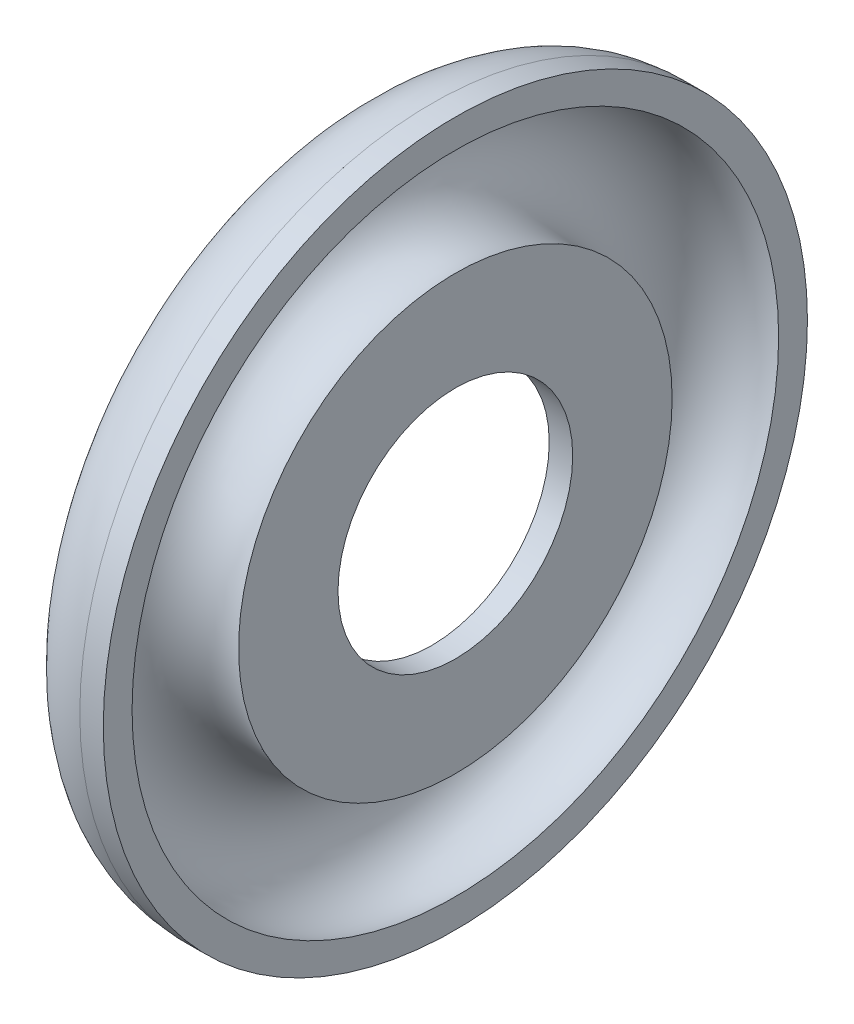
ISO-10303-21;
HEADER;
FILE_DESCRIPTION(('STEP AP214'),'2;1');
FILE_NAME('part.step','',(''),(''),'','','');
FILE_SCHEMA(('AUTOMOTIVE_DESIGN { 1 0 10303 214 1 1 1 1 }'));
ENDSEC;
DATA;
#1=APPLICATION_CONTEXT('core data for automotive mechanical design processes');
#2=APPLICATION_PROTOCOL_DEFINITION('international standard','automotive_design',2000,#1);
#3=PRODUCT_CONTEXT('',#1,'mechanical');
#4=PRODUCT('Part','Part','',(#3));
#5=PRODUCT_RELATED_PRODUCT_CATEGORY('part','',(#4));
#6=PRODUCT_DEFINITION_FORMATION('','',#4);
#7=PRODUCT_DEFINITION_CONTEXT('part definition',#1,'design');
#8=PRODUCT_DEFINITION('design','',#6,#7);
#9=PRODUCT_DEFINITION_SHAPE('','',#8);
#10=(LENGTH_UNIT() NAMED_UNIT(*) SI_UNIT(.MILLI.,.METRE.));
#11=(NAMED_UNIT(*) PLANE_ANGLE_UNIT() SI_UNIT($,.RADIAN.));
#12=(NAMED_UNIT(*) SI_UNIT($,.STERADIAN.) SOLID_ANGLE_UNIT());
#13=UNCERTAINTY_MEASURE_WITH_UNIT(LENGTH_MEASURE(1.E-05),#10,'distance_accuracy_value','');
#14=(GEOMETRIC_REPRESENTATION_CONTEXT(3) GLOBAL_UNCERTAINTY_ASSIGNED_CONTEXT((#13)) GLOBAL_UNIT_ASSIGNED_CONTEXT((#10,
#11,#12)) REPRESENTATION_CONTEXT('',''));
#15=CARTESIAN_POINT('',(0.,0.,0.));
#16=DIRECTION('',(0.,0.,1.));
#17=DIRECTION('',(1.,0.,0.));
#18=AXIS2_PLACEMENT_3D('',#15,#16,#17);
#19=CARTESIAN_POINT('',(0.,0.,0.));
#20=DIRECTION('',(1.,0.,0.));
#21=DIRECTION('',(0.,0.,-1.));
#22=AXIS2_PLACEMENT_3D('',#19,#20,#21);
#23=PLANE('',#22);
#24=CARTESIAN_POINT('',(0.,0.,0.));
#25=DIRECTION('',(1.,0.,0.));
#26=DIRECTION('',(0.,0.,-1.));
#27=AXIS2_PLACEMENT_3D('',#24,#25,#26);
#28=CIRCLE('',#27,15.);
#29=CARTESIAN_POINT('',(0.,0.,-15.));
#30=VERTEX_POINT('',#29);
#31=EDGE_CURVE('E44',#30,#30,#28,.T.);
#32=ORIENTED_EDGE('',*,*,#31,.F.);
#33=EDGE_LOOP('',(#32));
#34=FACE_BOUND('',#33,.T.);
#35=CARTESIAN_POINT('',(0.,0.,0.));
#36=DIRECTION('',(1.,0.,0.));
#37=DIRECTION('',(0.,0.,-1.));
#38=AXIS2_PLACEMENT_3D('',#35,#36,#37);
#39=CIRCLE('',#38,14.9840729394555);
#40=CARTESIAN_POINT('',(0.,0.,-14.9840729394555));
#41=VERTEX_POINT('',#40);
#42=EDGE_CURVE('E70',#41,#41,#39,.T.);
#43=ORIENTED_EDGE('',*,*,#42,.T.);
#44=EDGE_LOOP('',(#43));
#45=FACE_BOUND('',#44,.T.);
#46=ADVANCED_FACE('F40',(#34,#45),#23,.F.);
#47=CARTESIAN_POINT('',(1.,0.,0.));
#48=DIRECTION('',(-1.,0.,0.));
#49=DIRECTION('',(0.,0.,1.));
#50=AXIS2_PLACEMENT_3D('',#47,#48,#49);
#51=CYLINDRICAL_SURFACE('',#50,15.);
#52=CARTESIAN_POINT('',(1.,0.,0.));
#53=DIRECTION('',(1.,0.,0.));
#54=DIRECTION('',(0.,0.,-1.));
#55=AXIS2_PLACEMENT_3D('',#52,#53,#54);
#56=CIRCLE('',#55,15.);
#57=CARTESIAN_POINT('',(1.,0.,-15.));
#58=VERTEX_POINT('',#57);
#59=EDGE_CURVE('E11',#58,#58,#56,.T.);
#60=ORIENTED_EDGE('',*,*,#59,.F.);
#61=EDGE_LOOP('',(#60));
#62=FACE_BOUND('',#61,.T.);
#63=ORIENTED_EDGE('',*,*,#31,.T.);
#64=EDGE_LOOP('',(#63));
#65=FACE_BOUND('',#64,.T.);
#66=ADVANCED_FACE('F42',(#62,#65),#51,.T.);
#67=CARTESIAN_POINT('',(1.,0.,0.));
#68=DIRECTION('',(1.,0.,0.));
#69=DIRECTION('',(0.,0.,-1.));
#70=AXIS2_PLACEMENT_3D('',#67,#68,#69);
#71=PLANE('',#70);
#72=CARTESIAN_POINT('',(1.,0.,0.));
#73=DIRECTION('',(1.,0.,0.));
#74=DIRECTION('',(0.,0.,-1.));
#75=AXIS2_PLACEMENT_3D('',#72,#73,#74);
#76=CIRCLE('',#75,13.7734893729599);
#77=CARTESIAN_POINT('',(1.,0.,-13.7734893729599));
#78=VERTEX_POINT('',#77);
#79=EDGE_CURVE('E75',#78,#78,#76,.T.);
#80=ORIENTED_EDGE('',*,*,#79,.F.);
#81=EDGE_LOOP('',(#80));
#82=FACE_BOUND('',#81,.T.);
#83=ORIENTED_EDGE('',*,*,#59,.T.);
#84=EDGE_LOOP('',(#83));
#85=FACE_BOUND('',#84,.T.);
#86=ADVANCED_FACE('F90',(#82,#85),#71,.T.);
#87=CARTESIAN_POINT('',(0.,0.,0.));
#88=DIRECTION('',(1.,0.,0.));
#89=DIRECTION('',(0.,0.,-1.));
#90=AXIS2_PLACEMENT_3D('',#87,#88,#89);
#91=TOROIDAL_SURFACE('',#90,11.5044268401476,3.47964609930784);
#92=CARTESIAN_POINT('',(0.,0.,-11.5044268401476));
#93=DIRECTION('',(0.,1.,0.));
#94=DIRECTION('',(0.,0.,1.));
#95=AXIS2_PLACEMENT_3D('',#92,#93,#94);
#96=CIRCLE('',#95,3.47964609930784);
#97=CARTESIAN_POINT('',(0.,0.,-8.02478074083979));
#98=VERTEX_POINT('',#97);
#99=EDGE_CURVE('E65',#41,#98,#96,.T.);
#100=ORIENTED_EDGE('',*,*,#99,.F.);
#101=ORIENTED_EDGE('',*,*,#42,.F.);
#102=ORIENTED_EDGE('',*,*,#99,.T.);
#103=CARTESIAN_POINT('',(0.,0.,0.));
#104=DIRECTION('',(1.,0.,0.));
#105=DIRECTION('',(0.,0.,-1.));
#106=AXIS2_PLACEMENT_3D('',#103,#104,#105);
#107=CIRCLE('',#106,8.02478074083979);
#108=EDGE_CURVE('E68',#98,#98,#107,.T.);
#109=ORIENTED_EDGE('',*,*,#108,.T.);
#110=EDGE_LOOP('',(#100,#101,#102,#109));
#111=FACE_BOUND('',#110,.T.);
#112=ADVANCED_FACE('F66',(#111),#91,.T.);
#113=CARTESIAN_POINT('',(0.,0.,0.));
#114=DIRECTION('',(1.,0.,0.));
#115=DIRECTION('',(0.,0.,-1.));
#116=AXIS2_PLACEMENT_3D('',#113,#114,#115);
#117=CIRCLE('',#116,5.);
#118=CARTESIAN_POINT('',(0.,0.,-5.));
#119=VERTEX_POINT('',#118);
#120=EDGE_CURVE('E106',#119,#119,#117,.T.);
#121=ORIENTED_EDGE('',*,*,#120,.T.);
#122=EDGE_LOOP('',(#121));
#123=FACE_BOUND('',#122,.T.);
#124=ORIENTED_EDGE('',*,*,#108,.F.);
#125=EDGE_LOOP('',(#124));
#126=FACE_BOUND('',#125,.T.);
#127=ADVANCED_FACE('F85',(#123,#126),#23,.F.);
#128=CARTESIAN_POINT('',(0.,0.,0.));
#129=DIRECTION('',(1.,0.,0.));
#130=DIRECTION('',(0.,0.,-1.));
#131=AXIS2_PLACEMENT_3D('',#128,#129,#130);
#132=TOROIDAL_SURFACE('',#131,11.5044268401476,2.47964609930784);
#133=CARTESIAN_POINT('',(0.,0.,-11.5044268401476));
#134=DIRECTION('',(0.,-1.,0.));
#135=DIRECTION('',(0.,0.,-1.));
#136=AXIS2_PLACEMENT_3D('',#133,#134,#135);
#137=CIRCLE('',#136,2.47964609930784);
#138=CARTESIAN_POINT('',(1.,0.,-9.23536430733532));
#139=VERTEX_POINT('',#138);
#140=EDGE_CURVE('E55',#78,#139,#137,.F.);
#141=ORIENTED_EDGE('',*,*,#140,.T.);
#142=CARTESIAN_POINT('',(1.,0.,0.));
#143=DIRECTION('',(-1.,0.,0.));
#144=DIRECTION('',(0.,0.,1.));
#145=AXIS2_PLACEMENT_3D('',#142,#143,#144);
#146=CIRCLE('',#145,9.23536430733532);
#147=EDGE_CURVE('E71',#139,#139,#146,.F.);
#148=ORIENTED_EDGE('',*,*,#147,.F.);
#149=ORIENTED_EDGE('',*,*,#140,.F.);
#150=ORIENTED_EDGE('',*,*,#79,.T.);
#151=EDGE_LOOP('',(#141,#148,#149,#150));
#152=FACE_BOUND('',#151,.T.);
#153=ADVANCED_FACE('F94',(#152),#132,.F.);
#154=CARTESIAN_POINT('',(1.,0.,0.));
#155=DIRECTION('',(-1.,0.,0.));
#156=DIRECTION('',(0.,0.,1.));
#157=AXIS2_PLACEMENT_3D('',#154,#155,#156);
#158=CIRCLE('',#157,5.);
#159=CARTESIAN_POINT('',(1.,0.,5.));
#160=VERTEX_POINT('',#159);
#161=EDGE_CURVE('E108',#160,#160,#158,.T.);
#162=ORIENTED_EDGE('',*,*,#161,.T.);
#163=EDGE_LOOP('',(#162));
#164=FACE_BOUND('',#163,.T.);
#165=ORIENTED_EDGE('',*,*,#147,.T.);
#166=EDGE_LOOP('',(#165));
#167=FACE_BOUND('',#166,.T.);
#168=ADVANCED_FACE('F100',(#164,#167),#71,.T.);
#169=CARTESIAN_POINT('',(1.,0.,0.));
#170=DIRECTION('',(-1.,0.,0.));
#171=DIRECTION('',(0.,0.,1.));
#172=AXIS2_PLACEMENT_3D('',#169,#170,#171);
#173=CYLINDRICAL_SURFACE('',#172,5.);
#174=ORIENTED_EDGE('',*,*,#161,.F.);
#175=EDGE_LOOP('',(#174));
#176=FACE_BOUND('',#175,.T.);
#177=ORIENTED_EDGE('',*,*,#120,.F.);
#178=EDGE_LOOP('',(#177));
#179=FACE_BOUND('',#178,.T.);
#180=ADVANCED_FACE('F120',(#176,#179),#173,.F.);
#181=CLOSED_SHELL('',(#46,#66,#86,#112,#127,#153,#168,#180));
#182=MANIFOLD_SOLID_BREP('B2',#181);
#183=ADVANCED_BREP_SHAPE_REPRESENTATION('',(#18,#182),#14);
#184=SHAPE_DEFINITION_REPRESENTATION(#9,#183);
ENDSEC;
END-ISO-10303-21;
